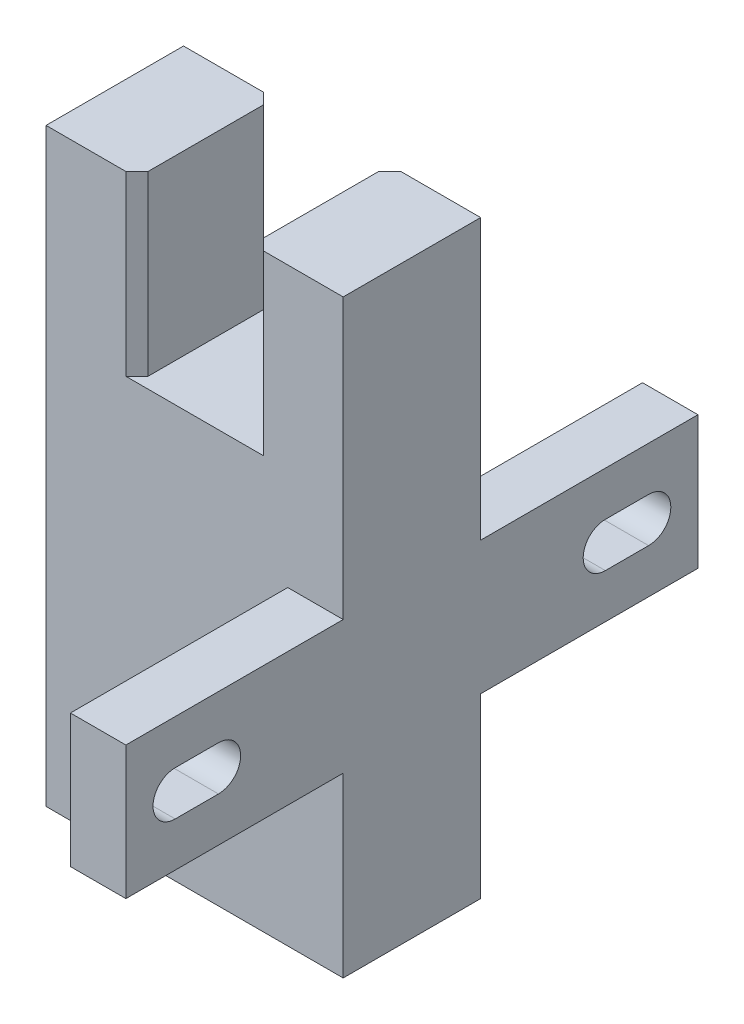
ISO-10303-21;
HEADER;
FILE_DESCRIPTION(('STEP AP214'),'2;1');
FILE_NAME('part.step','',(''),(''),'','','');
FILE_SCHEMA(('AUTOMOTIVE_DESIGN { 1 0 10303 214 1 1 1 1 }'));
ENDSEC;
DATA;
#1=APPLICATION_CONTEXT('core data for automotive mechanical design processes');
#2=APPLICATION_PROTOCOL_DEFINITION('international standard','automotive_design',2000,#1);
#3=PRODUCT_CONTEXT('',#1,'mechanical');
#4=PRODUCT('Part','Part','',(#3));
#5=PRODUCT_RELATED_PRODUCT_CATEGORY('part','',(#4));
#6=PRODUCT_DEFINITION_FORMATION('','',#4);
#7=PRODUCT_DEFINITION_CONTEXT('part definition',#1,'design');
#8=PRODUCT_DEFINITION('design','',#6,#7);
#9=PRODUCT_DEFINITION_SHAPE('','',#8);
#10=(LENGTH_UNIT() NAMED_UNIT(*) SI_UNIT(.MILLI.,.METRE.));
#11=(NAMED_UNIT(*) PLANE_ANGLE_UNIT() SI_UNIT($,.RADIAN.));
#12=(NAMED_UNIT(*) SI_UNIT($,.STERADIAN.) SOLID_ANGLE_UNIT());
#13=UNCERTAINTY_MEASURE_WITH_UNIT(LENGTH_MEASURE(1.E-05),#10,'distance_accuracy_value','');
#14=(GEOMETRIC_REPRESENTATION_CONTEXT(3) GLOBAL_UNCERTAINTY_ASSIGNED_CONTEXT((#13)) GLOBAL_UNIT_ASSIGNED_CONTEXT((#10,
#11,#12)) REPRESENTATION_CONTEXT('',''));
#15=CARTESIAN_POINT('',(0.,0.,0.));
#16=DIRECTION('',(0.,0.,1.));
#17=DIRECTION('',(1.,0.,0.));
#18=AXIS2_PLACEMENT_3D('',#15,#16,#17);
#19=CARTESIAN_POINT('',(0.,0.,6.2));
#20=DIRECTION('',(0.,0.,-1.));
#21=DIRECTION('',(-1.,0.,0.));
#22=AXIS2_PLACEMENT_3D('',#19,#20,#21);
#23=PLANE('',#22);
#24=DIRECTION('',(-1.,0.,0.));
#25=VECTOR('',#24,1.);
#26=CARTESIAN_POINT('',(2.6,8.79547249401344,6.2));
#27=LINE('',#26,#25);
#28=CARTESIAN_POINT('',(6.7,8.79547249401344,6.2));
#29=VERTEX_POINT('',#28);
#30=CARTESIAN_POINT('',(3.1,8.79547249401344,6.2));
#31=VERTEX_POINT('',#30);
#32=EDGE_CURVE('E387',#29,#31,#27,.T.);
#33=ORIENTED_EDGE('',*,*,#32,.T.);
#34=DIRECTION('',(0.,-1.,0.));
#35=VECTOR('',#34,1.);
#36=CARTESIAN_POINT('',(3.1,0.,6.2));
#37=LINE('',#36,#35);
#38=CARTESIAN_POINT('',(3.1,0.795472494013436,6.2));
#39=VERTEX_POINT('',#38);
#40=EDGE_CURVE('E511',#31,#39,#37,.T.);
#41=ORIENTED_EDGE('',*,*,#40,.T.);
#42=DIRECTION('',(-1.,0.,0.));
#43=VECTOR('',#42,1.);
#44=CARTESIAN_POINT('',(2.6,0.795472494013436,6.2));
#45=LINE('',#44,#43);
#46=CARTESIAN_POINT('',(-3.1,0.795472494013436,6.2));
#47=VERTEX_POINT('',#46);
#48=EDGE_CURVE('E391',#39,#47,#45,.T.);
#49=ORIENTED_EDGE('',*,*,#48,.T.);
#50=DIRECTION('',(0.,1.,0.));
#51=VECTOR('',#50,1.);
#52=CARTESIAN_POINT('',(-3.1,0.,6.2));
#53=LINE('',#52,#51);
#54=CARTESIAN_POINT('',(-3.1,8.79547249401344,6.2));
#55=VERTEX_POINT('',#54);
#56=EDGE_CURVE('E507',#47,#55,#53,.T.);
#57=ORIENTED_EDGE('',*,*,#56,.T.);
#58=DIRECTION('',(-1.,0.,0.));
#59=VECTOR('',#58,1.);
#60=CARTESIAN_POINT('',(-2.6,8.79547249401344,6.2));
#61=LINE('',#60,#59);
#62=CARTESIAN_POINT('',(-6.7,8.79547249401344,6.2));
#63=VERTEX_POINT('',#62);
#64=EDGE_CURVE('E395',#55,#63,#61,.T.);
#65=ORIENTED_EDGE('',*,*,#64,.T.);
#66=DIRECTION('',(0.,-1.,0.));
#67=VECTOR('',#66,1.);
#68=CARTESIAN_POINT('',(-6.7,8.79547249401344,6.2));
#69=LINE('',#68,#67);
#70=CARTESIAN_POINT('',(-6.7,-17.8045275059866,6.2));
#71=VERTEX_POINT('',#70);
#72=EDGE_CURVE('E398',#63,#71,#69,.T.);
#73=ORIENTED_EDGE('',*,*,#72,.T.);
#74=DIRECTION('',(1.,0.,0.));
#75=VECTOR('',#74,1.);
#76=CARTESIAN_POINT('',(-6.7,-17.8045275059866,6.2));
#77=LINE('',#76,#75);
#78=CARTESIAN_POINT('',(6.7,-17.8045275059866,6.2));
#79=VERTEX_POINT('',#78);
#80=EDGE_CURVE('E401',#71,#79,#77,.T.);
#81=ORIENTED_EDGE('',*,*,#80,.T.);
#82=DIRECTION('',(0.,1.,0.));
#83=VECTOR('',#82,1.);
#84=CARTESIAN_POINT('',(6.7,8.79547249401344,6.2));
#85=LINE('',#84,#83);
#86=CARTESIAN_POINT('',(6.7,-9.80452750598655,6.2));
#87=VERTEX_POINT('',#86);
#88=EDGE_CURVE('E405',#79,#87,#85,.T.);
#89=ORIENTED_EDGE('',*,*,#88,.T.);
#90=DIRECTION('',(1.,0.,0.));
#91=VECTOR('',#90,1.);
#92=CARTESIAN_POINT('',(6.7,-9.80452750598656,6.2));
#93=LINE('',#92,#91);
#94=CARTESIAN_POINT('',(4.2,-9.80452750598656,6.2));
#95=VERTEX_POINT('',#94);
#96=EDGE_CURVE('E351',#95,#87,#93,.T.);
#97=ORIENTED_EDGE('',*,*,#96,.F.);
#98=DIRECTION('',(0.,-1.,0.));
#99=VECTOR('',#98,1.);
#100=CARTESIAN_POINT('',(4.2,-9.80452750598656,6.2));
#101=LINE('',#100,#99);
#102=CARTESIAN_POINT('',(4.2,-3.80452750598656,6.2));
#103=VERTEX_POINT('',#102);
#104=EDGE_CURVE('E364',#103,#95,#101,.T.);
#105=ORIENTED_EDGE('',*,*,#104,.F.);
#106=DIRECTION('',(-1.,0.,0.));
#107=VECTOR('',#106,1.);
#108=CARTESIAN_POINT('',(6.7,-3.80452750598656,6.2));
#109=LINE('',#108,#107);
#110=CARTESIAN_POINT('',(6.7,-3.80452750598656,6.2));
#111=VERTEX_POINT('',#110);
#112=EDGE_CURVE('E345',#111,#103,#109,.T.);
#113=ORIENTED_EDGE('',*,*,#112,.F.);
#114=EDGE_CURVE('E404',#111,#29,#85,.T.);
#115=ORIENTED_EDGE('',*,*,#114,.T.);
#116=EDGE_LOOP('',(#33,#41,#49,#57,#65,#73,#81,#89,#97,#105,#113,#115));
#117=FACE_BOUND('',#116,.T.);
#118=ADVANCED_FACE('F47',(#117),#23,.F.);
#119=CARTESIAN_POINT('',(2.6,8.79547249401344,6.2));
#120=DIRECTION('',(0.,-1.,0.));
#121=DIRECTION('',(1.,0.,0.));
#122=AXIS2_PLACEMENT_3D('',#119,#120,#121);
#123=PLANE('',#122);
#124=DIRECTION('',(-1.,0.,0.));
#125=VECTOR('',#124,1.);
#126=CARTESIAN_POINT('',(2.6,8.79547249401344,0.));
#127=LINE('',#126,#125);
#128=CARTESIAN_POINT('',(6.7,8.79547249401344,0.));
#129=VERTEX_POINT('',#128);
#130=CARTESIAN_POINT('',(3.1,8.79547249401344,0.));
#131=VERTEX_POINT('',#130);
#132=EDGE_CURVE('E386',#129,#131,#127,.T.);
#133=ORIENTED_EDGE('',*,*,#132,.T.);
#134=DIRECTION('',(-0.707106781186547,0.,0.707106781186548));
#135=VECTOR('',#134,1.);
#136=CARTESIAN_POINT('',(2.6,8.79547249401344,0.500000000000005));
#137=LINE('',#136,#135);
#138=CARTESIAN_POINT('',(2.6,8.79547249401344,0.500000000000006));
#139=VERTEX_POINT('',#138);
#140=EDGE_CURVE('E504',#131,#139,#137,.T.);
#141=ORIENTED_EDGE('',*,*,#140,.T.);
#142=DIRECTION('',(0.,0.,-1.));
#143=VECTOR('',#142,1.);
#144=CARTESIAN_POINT('',(2.6,8.79547249401344,6.2));
#145=LINE('',#144,#143);
#146=CARTESIAN_POINT('',(2.6,8.79547249401344,5.7));
#147=VERTEX_POINT('',#146);
#148=EDGE_CURVE('E454',#147,#139,#145,.T.);
#149=ORIENTED_EDGE('',*,*,#148,.F.);
#150=DIRECTION('',(-0.707106781186545,0.,-0.70710678118655));
#151=VECTOR('',#150,1.);
#152=CARTESIAN_POINT('',(3.1,8.79547249401344,6.2));
#153=LINE('',#152,#151);
#154=EDGE_CURVE('E501',#147,#31,#153,.F.);
#155=ORIENTED_EDGE('',*,*,#154,.T.);
#156=ORIENTED_EDGE('',*,*,#32,.F.);
#157=DIRECTION('',(0.,0.,-1.));
#158=VECTOR('',#157,1.);
#159=CARTESIAN_POINT('',(6.7,8.79547249401344,6.2));
#160=LINE('',#159,#158);
#161=EDGE_CURVE('E408',#29,#129,#160,.T.);
#162=ORIENTED_EDGE('',*,*,#161,.T.);
#163=EDGE_LOOP('',(#133,#141,#149,#155,#156,#162));
#164=FACE_BOUND('',#163,.T.);
#165=ADVANCED_FACE('F545',(#164),#123,.F.);
#166=CARTESIAN_POINT('',(2.6,0.795472494013436,6.2));
#167=DIRECTION('',(1.,0.,0.));
#168=DIRECTION('',(0.,1.,0.));
#169=AXIS2_PLACEMENT_3D('',#166,#167,#168);
#170=PLANE('',#169);
#171=ORIENTED_EDGE('',*,*,#148,.T.);
#172=DIRECTION('',(0.,-1.,0.));
#173=VECTOR('',#172,1.);
#174=CARTESIAN_POINT('',(2.6,0.795472494013436,0.500000000000004));
#175=LINE('',#174,#173);
#176=CARTESIAN_POINT('',(2.6,0.795472494013436,0.500000000000006));
#177=VERTEX_POINT('',#176);
#178=EDGE_CURVE('E490',#139,#177,#175,.T.);
#179=ORIENTED_EDGE('',*,*,#178,.T.);
#180=DIRECTION('',(0.,0.,-1.));
#181=VECTOR('',#180,1.);
#182=CARTESIAN_POINT('',(2.6,0.795472494013436,6.2));
#183=LINE('',#182,#181);
#184=CARTESIAN_POINT('',(2.6,0.795472494013436,5.7));
#185=VERTEX_POINT('',#184);
#186=EDGE_CURVE('E450',#185,#177,#183,.T.);
#187=ORIENTED_EDGE('',*,*,#186,.F.);
#188=DIRECTION('',(0.,1.,0.));
#189=VECTOR('',#188,1.);
#190=CARTESIAN_POINT('',(2.6,0.795472494013436,5.7));
#191=LINE('',#190,#189);
#192=EDGE_CURVE('E487',#185,#147,#191,.T.);
#193=ORIENTED_EDGE('',*,*,#192,.T.);
#194=EDGE_LOOP('',(#171,#179,#187,#193));
#195=FACE_BOUND('',#194,.T.);
#196=ADVANCED_FACE('F555',(#195),#170,.F.);
#197=CARTESIAN_POINT('',(2.6,0.795472494013436,6.2));
#198=DIRECTION('',(0.,-1.,0.));
#199=DIRECTION('',(0.,0.,-1.));
#200=AXIS2_PLACEMENT_3D('',#197,#198,#199);
#201=PLANE('',#200);
#202=DIRECTION('',(-1.,0.,0.));
#203=VECTOR('',#202,1.);
#204=CARTESIAN_POINT('',(2.6,0.795472494013436,0.));
#205=LINE('',#204,#203);
#206=CARTESIAN_POINT('',(3.1,0.795472494013436,0.));
#207=VERTEX_POINT('',#206);
#208=CARTESIAN_POINT('',(-3.1,0.795472494013436,0.));
#209=VERTEX_POINT('',#208);
#210=EDGE_CURVE('E412',#207,#209,#205,.T.);
#211=ORIENTED_EDGE('',*,*,#210,.T.);
#212=DIRECTION('',(0.707106781186547,0.,0.707106781186548));
#213=VECTOR('',#212,1.);
#214=CARTESIAN_POINT('',(2.85,0.795472494013436,5.95));
#215=LINE('',#214,#213);
#216=CARTESIAN_POINT('',(-2.6,0.795472494013436,0.500000000000006));
#217=VERTEX_POINT('',#216);
#218=EDGE_CURVE('E57',#209,#217,#215,.T.);
#219=ORIENTED_EDGE('',*,*,#218,.T.);
#220=DIRECTION('',(0.,0.,-1.));
#221=VECTOR('',#220,1.);
#222=CARTESIAN_POINT('',(-2.6,0.795472494013436,6.2));
#223=LINE('',#222,#221);
#224=CARTESIAN_POINT('',(-2.6,0.795472494013436,5.7));
#225=VERTEX_POINT('',#224);
#226=EDGE_CURVE('E447',#225,#217,#223,.T.);
#227=ORIENTED_EDGE('',*,*,#226,.F.);
#228=DIRECTION('',(0.707106781186545,0.,-0.70710678118655));
#229=VECTOR('',#228,1.);
#230=CARTESIAN_POINT('',(-0.250000000000023,0.795472494013436,3.35));
#231=LINE('',#230,#229);
#232=EDGE_CURVE('E11',#225,#47,#231,.F.);
#233=ORIENTED_EDGE('',*,*,#232,.T.);
#234=ORIENTED_EDGE('',*,*,#48,.F.);
#235=DIRECTION('',(0.707106781186545,0.,0.70710678118655));
#236=VECTOR('',#235,1.);
#237=CARTESIAN_POINT('',(2.85,0.795472494013436,5.95));
#238=LINE('',#237,#236);
#239=EDGE_CURVE('E531',#39,#185,#238,.F.);
#240=ORIENTED_EDGE('',*,*,#239,.T.);
#241=ORIENTED_EDGE('',*,*,#186,.T.);
#242=DIRECTION('',(0.707106781186547,0.,-0.707106781186548));
#243=VECTOR('',#242,1.);
#244=CARTESIAN_POINT('',(-0.249999999999998,0.795472494013436,3.35000000000001));
#245=LINE('',#244,#243);
#246=EDGE_CURVE('E527',#177,#207,#245,.T.);
#247=ORIENTED_EDGE('',*,*,#246,.T.);
#248=EDGE_LOOP('',(#211,#219,#227,#233,#234,#240,#241,#247));
#249=FACE_BOUND('',#248,.T.);
#250=ADVANCED_FACE('F616',(#249),#201,.F.);
#251=CARTESIAN_POINT('',(-2.6,0.795472494013436,6.2));
#252=DIRECTION('',(-1.,0.,0.));
#253=DIRECTION('',(0.,-1.,0.));
#254=AXIS2_PLACEMENT_3D('',#251,#252,#253);
#255=PLANE('',#254);
#256=ORIENTED_EDGE('',*,*,#226,.T.);
#257=DIRECTION('',(0.,1.,0.));
#258=VECTOR('',#257,1.);
#259=CARTESIAN_POINT('',(-2.6,8.79547249401344,0.500000000000004));
#260=LINE('',#259,#258);
#261=CARTESIAN_POINT('',(-2.6,8.79547249401344,0.500000000000006));
#262=VERTEX_POINT('',#261);
#263=EDGE_CURVE('E517',#217,#262,#260,.T.);
#264=ORIENTED_EDGE('',*,*,#263,.T.);
#265=DIRECTION('',(0.,0.,-1.));
#266=VECTOR('',#265,1.);
#267=CARTESIAN_POINT('',(-2.6,8.79547249401344,6.2));
#268=LINE('',#267,#266);
#269=CARTESIAN_POINT('',(-2.6,8.79547249401344,5.7));
#270=VERTEX_POINT('',#269);
#271=EDGE_CURVE('E443',#270,#262,#268,.T.);
#272=ORIENTED_EDGE('',*,*,#271,.F.);
#273=DIRECTION('',(0.,-1.,0.));
#274=VECTOR('',#273,1.);
#275=CARTESIAN_POINT('',(-2.6,0.795472494013436,5.7));
#276=LINE('',#275,#274);
#277=EDGE_CURVE('E70',#270,#225,#276,.T.);
#278=ORIENTED_EDGE('',*,*,#277,.T.);
#279=EDGE_LOOP('',(#256,#264,#272,#278));
#280=FACE_BOUND('',#279,.T.);
#281=ADVANCED_FACE('F612',(#280),#255,.F.);
#282=CARTESIAN_POINT('',(-2.6,8.79547249401344,6.2));
#283=DIRECTION('',(0.,-1.,0.));
#284=DIRECTION('',(0.,0.,-1.));
#285=AXIS2_PLACEMENT_3D('',#282,#283,#284);
#286=PLANE('',#285);
#287=ORIENTED_EDGE('',*,*,#271,.T.);
#288=DIRECTION('',(-0.707106781186547,0.,-0.707106781186548));
#289=VECTOR('',#288,1.);
#290=CARTESIAN_POINT('',(-2.6,8.79547249401344,0.500000000000004));
#291=LINE('',#290,#289);
#292=CARTESIAN_POINT('',(-3.1,8.79547249401344,0.));
#293=VERTEX_POINT('',#292);
#294=EDGE_CURVE('E524',#262,#293,#291,.T.);
#295=ORIENTED_EDGE('',*,*,#294,.T.);
#296=DIRECTION('',(-1.,0.,0.));
#297=VECTOR('',#296,1.);
#298=CARTESIAN_POINT('',(-2.6,8.79547249401344,0.));
#299=LINE('',#298,#297);
#300=CARTESIAN_POINT('',(-6.7,8.79547249401344,0.));
#301=VERTEX_POINT('',#300);
#302=EDGE_CURVE('E415',#293,#301,#299,.T.);
#303=ORIENTED_EDGE('',*,*,#302,.T.);
#304=DIRECTION('',(0.,0.,-1.));
#305=VECTOR('',#304,1.);
#306=CARTESIAN_POINT('',(-6.7,8.79547249401344,6.2));
#307=LINE('',#306,#305);
#308=EDGE_CURVE('E439',#63,#301,#307,.T.);
#309=ORIENTED_EDGE('',*,*,#308,.F.);
#310=ORIENTED_EDGE('',*,*,#64,.F.);
#311=DIRECTION('',(-0.707106781186545,0.,0.70710678118655));
#312=VECTOR('',#311,1.);
#313=CARTESIAN_POINT('',(-3.1,8.79547249401343,6.2));
#314=LINE('',#313,#312);
#315=EDGE_CURVE('E521',#55,#270,#314,.F.);
#316=ORIENTED_EDGE('',*,*,#315,.T.);
#317=EDGE_LOOP('',(#287,#295,#303,#309,#310,#316));
#318=FACE_BOUND('',#317,.T.);
#319=ADVANCED_FACE('F608',(#318),#286,.F.);
#320=CARTESIAN_POINT('',(-6.7,8.79547249401344,6.2));
#321=DIRECTION('',(1.,0.,0.));
#322=DIRECTION('',(0.,0.,-1.));
#323=AXIS2_PLACEMENT_3D('',#320,#321,#322);
#324=PLANE('',#323);
#325=DIRECTION('',(0.,-1.,0.));
#326=VECTOR('',#325,1.);
#327=CARTESIAN_POINT('',(-6.7,8.79547249401344,0.));
#328=LINE('',#327,#326);
#329=CARTESIAN_POINT('',(-6.7,-17.8045275059866,0.));
#330=VERTEX_POINT('',#329);
#331=EDGE_CURVE('E418',#301,#330,#328,.T.);
#332=ORIENTED_EDGE('',*,*,#331,.T.);
#333=DIRECTION('',(0.,0.,-1.));
#334=VECTOR('',#333,1.);
#335=CARTESIAN_POINT('',(-6.7,-17.8045275059866,6.2));
#336=LINE('',#335,#334);
#337=EDGE_CURVE('E435',#71,#330,#336,.T.);
#338=ORIENTED_EDGE('',*,*,#337,.F.);
#339=ORIENTED_EDGE('',*,*,#72,.F.);
#340=ORIENTED_EDGE('',*,*,#308,.T.);
#341=EDGE_LOOP('',(#332,#338,#339,#340));
#342=FACE_BOUND('',#341,.T.);
#343=ADVANCED_FACE('F604',(#342),#324,.F.);
#344=CARTESIAN_POINT('',(-6.7,-17.8045275059866,6.2));
#345=DIRECTION('',(0.,1.,0.));
#346=DIRECTION('',(0.,0.,1.));
#347=AXIS2_PLACEMENT_3D('',#344,#345,#346);
#348=PLANE('',#347);
#349=DIRECTION('',(1.,0.,0.));
#350=VECTOR('',#349,1.);
#351=CARTESIAN_POINT('',(-6.7,-17.8045275059866,0.));
#352=LINE('',#351,#350);
#353=CARTESIAN_POINT('',(6.7,-17.8045275059866,0.));
#354=VERTEX_POINT('',#353);
#355=EDGE_CURVE('E421',#330,#354,#352,.T.);
#356=ORIENTED_EDGE('',*,*,#355,.T.);
#357=DIRECTION('',(0.,0.,-1.));
#358=VECTOR('',#357,1.);
#359=CARTESIAN_POINT('',(6.7,-17.8045275059866,6.2));
#360=LINE('',#359,#358);
#361=EDGE_CURVE('E431',#79,#354,#360,.T.);
#362=ORIENTED_EDGE('',*,*,#361,.F.);
#363=ORIENTED_EDGE('',*,*,#80,.F.);
#364=ORIENTED_EDGE('',*,*,#337,.T.);
#365=EDGE_LOOP('',(#356,#362,#363,#364));
#366=FACE_BOUND('',#365,.T.);
#367=ADVANCED_FACE('F601',(#366),#348,.F.);
#368=CARTESIAN_POINT('',(6.7,8.79547249401344,6.2));
#369=DIRECTION('',(-1.,0.,0.));
#370=DIRECTION('',(0.,-1.,0.));
#371=AXIS2_PLACEMENT_3D('',#368,#369,#370);
#372=PLANE('',#371);
#373=DIRECTION('',(0.,0.,-1.));
#374=VECTOR('',#373,1.);
#375=CARTESIAN_POINT('',(6.7,-7.80452750598656,13.7757131765971));
#376=LINE('',#375,#374);
#377=CARTESIAN_POINT('',(6.7,-7.80452750598657,13.7757131765971));
#378=VERTEX_POINT('',#377);
#379=CARTESIAN_POINT('',(6.7,-7.80452750598656,11.8242868234029));
#380=VERTEX_POINT('',#379);
#381=EDGE_CURVE('E251',#378,#380,#376,.T.);
#382=ORIENTED_EDGE('',*,*,#381,.F.);
#383=CARTESIAN_POINT('',(6.7,-6.80452750598656,13.7757131765971));
#384=DIRECTION('',(1.,0.,0.));
#385=DIRECTION('',(0.,1.,0.));
#386=AXIS2_PLACEMENT_3D('',#383,#384,#385);
#387=CIRCLE('',#386,1.);
#388=CARTESIAN_POINT('',(6.7,-5.80452750598656,13.7757131765971));
#389=VERTEX_POINT('',#388);
#390=EDGE_CURVE('E257',#389,#378,#387,.T.);
#391=ORIENTED_EDGE('',*,*,#390,.F.);
#392=DIRECTION('',(0.,0.,1.));
#393=VECTOR('',#392,1.);
#394=CARTESIAN_POINT('',(6.7,-5.80452750598656,13.7757131765971));
#395=LINE('',#394,#393);
#396=CARTESIAN_POINT('',(6.7,-5.80452750598656,11.8242868234029));
#397=VERTEX_POINT('',#396);
#398=EDGE_CURVE('E262',#397,#389,#395,.T.);
#399=ORIENTED_EDGE('',*,*,#398,.F.);
#400=CARTESIAN_POINT('',(6.7,-6.80452750598656,11.8242868234029));
#401=DIRECTION('',(1.,0.,0.));
#402=DIRECTION('',(0.,1.,0.));
#403=AXIS2_PLACEMENT_3D('',#400,#401,#402);
#404=CIRCLE('',#403,1.);
#405=EDGE_CURVE('E239',#380,#397,#404,.T.);
#406=ORIENTED_EDGE('',*,*,#405,.F.);
#407=EDGE_LOOP('',(#382,#391,#399,#406));
#408=FACE_BOUND('',#407,.T.);
#409=DIRECTION('',(0.,0.,1.));
#410=VECTOR('',#409,1.);
#411=CARTESIAN_POINT('',(6.7,-5.80452750598656,-7.57571317659705));
#412=LINE('',#411,#410);
#413=CARTESIAN_POINT('',(6.7,-5.80452750598656,-7.57571317659705));
#414=VERTEX_POINT('',#413);
#415=CARTESIAN_POINT('',(6.7,-5.80452750598656,-5.62428682340294));
#416=VERTEX_POINT('',#415);
#417=EDGE_CURVE('E298',#414,#416,#412,.T.);
#418=ORIENTED_EDGE('',*,*,#417,.F.);
#419=CARTESIAN_POINT('',(6.7,-6.80452750598655,-7.57571317659706));
#420=DIRECTION('',(1.,0.,0.));
#421=DIRECTION('',(0.,-1.,0.));
#422=AXIS2_PLACEMENT_3D('',#419,#420,#421);
#423=CIRCLE('',#422,1.);
#424=CARTESIAN_POINT('',(6.7,-7.80452750598656,-7.57571317659705));
#425=VERTEX_POINT('',#424);
#426=EDGE_CURVE('E302',#425,#414,#423,.T.);
#427=ORIENTED_EDGE('',*,*,#426,.F.);
#428=DIRECTION('',(0.,0.,-1.));
#429=VECTOR('',#428,1.);
#430=CARTESIAN_POINT('',(6.7,-7.80452750598656,-7.57571317659705));
#431=LINE('',#430,#429);
#432=CARTESIAN_POINT('',(6.7,-7.80452750598656,-5.62428682340294));
#433=VERTEX_POINT('',#432);
#434=EDGE_CURVE('E281',#433,#425,#431,.T.);
#435=ORIENTED_EDGE('',*,*,#434,.F.);
#436=CARTESIAN_POINT('',(6.7,-6.80452750598656,-5.62428682340294));
#437=DIRECTION('',(1.,0.,0.));
#438=DIRECTION('',(0.,-1.,0.));
#439=AXIS2_PLACEMENT_3D('',#436,#437,#438);
#440=CIRCLE('',#439,1.);
#441=EDGE_CURVE('E294',#416,#433,#440,.T.);
#442=ORIENTED_EDGE('',*,*,#441,.F.);
#443=EDGE_LOOP('',(#418,#427,#435,#442));
#444=FACE_BOUND('',#443,.T.);
#445=DIRECTION('',(0.,1.,0.));
#446=VECTOR('',#445,1.);
#447=CARTESIAN_POINT('',(6.7,8.79547249401344,0.));
#448=LINE('',#447,#446);
#449=CARTESIAN_POINT('',(6.7,-9.80452750598655,0.));
#450=VERTEX_POINT('',#449);
#451=EDGE_CURVE('E392',#354,#450,#448,.T.);
#452=ORIENTED_EDGE('',*,*,#451,.T.);
#453=DIRECTION('',(0.,0.,1.));
#454=VECTOR('',#453,1.);
#455=CARTESIAN_POINT('',(6.7,-9.80452750598656,-9.8));
#456=LINE('',#455,#454);
#457=CARTESIAN_POINT('',(6.7,-9.80452750598656,-9.8));
#458=VERTEX_POINT('',#457);
#459=EDGE_CURVE('E341',#458,#450,#456,.T.);
#460=ORIENTED_EDGE('',*,*,#459,.F.);
#461=DIRECTION('',(0.,-1.,0.));
#462=VECTOR('',#461,1.);
#463=CARTESIAN_POINT('',(6.7,-3.80452750598656,-9.8));
#464=LINE('',#463,#462);
#465=CARTESIAN_POINT('',(6.7,-3.80452750598656,-9.8));
#466=VERTEX_POINT('',#465);
#467=EDGE_CURVE('E305',#466,#458,#464,.T.);
#468=ORIENTED_EDGE('',*,*,#467,.F.);
#469=DIRECTION('',(0.,0.,1.));
#470=VECTOR('',#469,1.);
#471=CARTESIAN_POINT('',(6.7,-3.80452750598656,-9.8));
#472=LINE('',#471,#470);
#473=CARTESIAN_POINT('',(6.7,-3.80452750598656,0.));
#474=VERTEX_POINT('',#473);
#475=EDGE_CURVE('E319',#466,#474,#472,.T.);
#476=ORIENTED_EDGE('',*,*,#475,.T.);
#477=EDGE_CURVE('E424',#474,#129,#448,.T.);
#478=ORIENTED_EDGE('',*,*,#477,.T.);
#479=ORIENTED_EDGE('',*,*,#161,.F.);
#480=ORIENTED_EDGE('',*,*,#114,.F.);
#481=DIRECTION('',(0.,0.,-1.));
#482=VECTOR('',#481,1.);
#483=CARTESIAN_POINT('',(6.7,-3.80452750598656,16.));
#484=LINE('',#483,#482);
#485=CARTESIAN_POINT('',(6.7,-3.80452750598656,16.));
#486=VERTEX_POINT('',#485);
#487=EDGE_CURVE('E382',#486,#111,#484,.T.);
#488=ORIENTED_EDGE('',*,*,#487,.F.);
#489=DIRECTION('',(0.,1.,0.));
#490=VECTOR('',#489,1.);
#491=CARTESIAN_POINT('',(6.7,-9.80452750598656,16.));
#492=LINE('',#491,#490);
#493=CARTESIAN_POINT('',(6.7,-9.80452750598656,16.));
#494=VERTEX_POINT('',#493);
#495=EDGE_CURVE('E346',#494,#486,#492,.T.);
#496=ORIENTED_EDGE('',*,*,#495,.F.);
#497=DIRECTION('',(0.,0.,-1.));
#498=VECTOR('',#497,1.);
#499=CARTESIAN_POINT('',(6.7,-9.80452750598656,16.));
#500=LINE('',#499,#498);
#501=EDGE_CURVE('E360',#494,#87,#500,.T.);
#502=ORIENTED_EDGE('',*,*,#501,.T.);
#503=ORIENTED_EDGE('',*,*,#88,.F.);
#504=ORIENTED_EDGE('',*,*,#361,.T.);
#505=EDGE_LOOP('',(#452,#460,#468,#476,#478,#479,#480,#488,#496,#502,#503,#504));
#506=FACE_BOUND('',#505,.T.);
#507=ADVANCED_FACE('F259',(#408,#444,#506),#372,.F.);
#508=CARTESIAN_POINT('',(0.,0.,0.));
#509=DIRECTION('',(0.,0.,-1.));
#510=DIRECTION('',(-1.,0.,0.));
#511=AXIS2_PLACEMENT_3D('',#508,#509,#510);
#512=PLANE('',#511);
#513=ORIENTED_EDGE('',*,*,#210,.F.);
#514=DIRECTION('',(0.,1.,0.));
#515=VECTOR('',#514,1.);
#516=CARTESIAN_POINT('',(3.1,8.79547249401344,0.));
#517=LINE('',#516,#515);
#518=EDGE_CURVE('E498',#207,#131,#517,.T.);
#519=ORIENTED_EDGE('',*,*,#518,.T.);
#520=ORIENTED_EDGE('',*,*,#132,.F.);
#521=ORIENTED_EDGE('',*,*,#477,.F.);
#522=DIRECTION('',(1.,0.,0.));
#523=VECTOR('',#522,1.);
#524=CARTESIAN_POINT('',(6.7,-3.80452750598656,0.));
#525=LINE('',#524,#523);
#526=CARTESIAN_POINT('',(4.2,-3.80452750598656,0.));
#527=VERTEX_POINT('',#526);
#528=EDGE_CURVE('E310',#527,#474,#525,.T.);
#529=ORIENTED_EDGE('',*,*,#528,.F.);
#530=DIRECTION('',(0.,1.,0.));
#531=VECTOR('',#530,1.);
#532=CARTESIAN_POINT('',(4.2,-3.80452750598656,0.));
#533=LINE('',#532,#531);
#534=CARTESIAN_POINT('',(4.2,-9.80452750598656,0.));
#535=VERTEX_POINT('',#534);
#536=EDGE_CURVE('E323',#535,#527,#533,.T.);
#537=ORIENTED_EDGE('',*,*,#536,.F.);
#538=DIRECTION('',(-1.,0.,0.));
#539=VECTOR('',#538,1.);
#540=CARTESIAN_POINT('',(6.7,-9.80452750598656,0.));
#541=LINE('',#540,#539);
#542=EDGE_CURVE('E272',#450,#535,#541,.T.);
#543=ORIENTED_EDGE('',*,*,#542,.F.);
#544=ORIENTED_EDGE('',*,*,#451,.F.);
#545=ORIENTED_EDGE('',*,*,#355,.F.);
#546=ORIENTED_EDGE('',*,*,#331,.F.);
#547=ORIENTED_EDGE('',*,*,#302,.F.);
#548=DIRECTION('',(0.,-1.,0.));
#549=VECTOR('',#548,1.);
#550=CARTESIAN_POINT('',(-3.1,0.795472494013436,0.));
#551=LINE('',#550,#549);
#552=EDGE_CURVE('E494',#293,#209,#551,.T.);
#553=ORIENTED_EDGE('',*,*,#552,.T.);
#554=EDGE_LOOP('',(#513,#519,#520,#521,#529,#537,#543,#544,#545,#546,#547,#553));
#555=FACE_BOUND('',#554,.T.);
#556=ADVANCED_FACE('F547',(#555),#512,.T.);
#557=CARTESIAN_POINT('',(6.7,-3.80452750598656,16.));
#558=DIRECTION('',(0.,-1.,0.));
#559=DIRECTION('',(0.,0.,-1.));
#560=AXIS2_PLACEMENT_3D('',#557,#558,#559);
#561=PLANE('',#560);
#562=ORIENTED_EDGE('',*,*,#112,.T.);
#563=DIRECTION('',(0.,0.,-1.));
#564=VECTOR('',#563,1.);
#565=CARTESIAN_POINT('',(4.2,-3.80452750598656,16.));
#566=LINE('',#565,#564);
#567=CARTESIAN_POINT('',(4.2,-3.80452750598656,16.));
#568=VERTEX_POINT('',#567);
#569=EDGE_CURVE('E378',#568,#103,#566,.T.);
#570=ORIENTED_EDGE('',*,*,#569,.F.);
#571=DIRECTION('',(-1.,0.,0.));
#572=VECTOR('',#571,1.);
#573=CARTESIAN_POINT('',(6.7,-3.80452750598656,16.));
#574=LINE('',#573,#572);
#575=EDGE_CURVE('E350',#486,#568,#574,.T.);
#576=ORIENTED_EDGE('',*,*,#575,.F.);
#577=ORIENTED_EDGE('',*,*,#487,.T.);
#578=EDGE_LOOP('',(#562,#570,#576,#577));
#579=FACE_BOUND('',#578,.T.);
#580=ADVANCED_FACE('F566',(#579),#561,.F.);
#581=CARTESIAN_POINT('',(4.2,-9.80452750598656,16.));
#582=DIRECTION('',(1.,0.,0.));
#583=DIRECTION('',(0.,0.,-1.));
#584=AXIS2_PLACEMENT_3D('',#581,#582,#583);
#585=PLANE('',#584);
#586=DIRECTION('',(0.,0.,1.));
#587=VECTOR('',#586,1.);
#588=CARTESIAN_POINT('',(4.2,-5.80452750598656,16.));
#589=LINE('',#588,#587);
#590=CARTESIAN_POINT('',(4.2,-5.80452750598656,11.8242868234029));
#591=VERTEX_POINT('',#590);
#592=CARTESIAN_POINT('',(4.2,-5.80452750598656,13.7757131765971));
#593=VERTEX_POINT('',#592);
#594=EDGE_CURVE('E479',#591,#593,#589,.T.);
#595=ORIENTED_EDGE('',*,*,#594,.T.);
#596=CARTESIAN_POINT('',(4.2,-6.80452750598656,13.7757131765971));
#597=DIRECTION('',(1.,0.,0.));
#598=DIRECTION('',(0.,0.,-1.));
#599=AXIS2_PLACEMENT_3D('',#596,#597,#598);
#600=CIRCLE('',#599,1.);
#601=CARTESIAN_POINT('',(4.2,-7.80452750598656,13.7757131765971));
#602=VERTEX_POINT('',#601);
#603=EDGE_CURVE('E483',#593,#602,#600,.T.);
#604=ORIENTED_EDGE('',*,*,#603,.T.);
#605=DIRECTION('',(0.,0.,-1.));
#606=VECTOR('',#605,1.);
#607=CARTESIAN_POINT('',(4.2,-7.80452750598656,16.));
#608=LINE('',#607,#606);
#609=CARTESIAN_POINT('',(4.2,-7.80452750598656,11.8242868234029));
#610=VERTEX_POINT('',#609);
#611=EDGE_CURVE('E474',#602,#610,#608,.T.);
#612=ORIENTED_EDGE('',*,*,#611,.T.);
#613=CARTESIAN_POINT('',(4.2,-6.80452750598656,11.8242868234029));
#614=DIRECTION('',(1.,0.,0.));
#615=DIRECTION('',(0.,0.,-1.));
#616=AXIS2_PLACEMENT_3D('',#613,#614,#615);
#617=CIRCLE('',#616,1.);
#618=EDGE_CURVE('E242',#610,#591,#617,.T.);
#619=ORIENTED_EDGE('',*,*,#618,.T.);
#620=EDGE_LOOP('',(#595,#604,#612,#619));
#621=FACE_BOUND('',#620,.T.);
#622=ORIENTED_EDGE('',*,*,#104,.T.);
#623=DIRECTION('',(0.,0.,-1.));
#624=VECTOR('',#623,1.);
#625=CARTESIAN_POINT('',(4.2,-9.80452750598656,16.));
#626=LINE('',#625,#624);
#627=CARTESIAN_POINT('',(4.2,-9.80452750598656,16.));
#628=VERTEX_POINT('',#627);
#629=EDGE_CURVE('E374',#628,#95,#626,.T.);
#630=ORIENTED_EDGE('',*,*,#629,.F.);
#631=DIRECTION('',(0.,-1.,0.));
#632=VECTOR('',#631,1.);
#633=CARTESIAN_POINT('',(4.2,-9.80452750598656,16.));
#634=LINE('',#633,#632);
#635=EDGE_CURVE('E354',#568,#628,#634,.T.);
#636=ORIENTED_EDGE('',*,*,#635,.F.);
#637=ORIENTED_EDGE('',*,*,#569,.T.);
#638=EDGE_LOOP('',(#622,#630,#636,#637));
#639=FACE_BOUND('',#638,.T.);
#640=ADVANCED_FACE('F578',(#621,#639),#585,.F.);
#641=CARTESIAN_POINT('',(6.7,-9.80452750598656,16.));
#642=DIRECTION('',(0.,1.,0.));
#643=DIRECTION('',(0.,0.,1.));
#644=AXIS2_PLACEMENT_3D('',#641,#642,#643);
#645=PLANE('',#644);
#646=ORIENTED_EDGE('',*,*,#96,.T.);
#647=ORIENTED_EDGE('',*,*,#501,.F.);
#648=DIRECTION('',(1.,0.,0.));
#649=VECTOR('',#648,1.);
#650=CARTESIAN_POINT('',(6.7,-9.80452750598656,16.));
#651=LINE('',#650,#649);
#652=EDGE_CURVE('E357',#628,#494,#651,.T.);
#653=ORIENTED_EDGE('',*,*,#652,.F.);
#654=ORIENTED_EDGE('',*,*,#629,.T.);
#655=EDGE_LOOP('',(#646,#647,#653,#654));
#656=FACE_BOUND('',#655,.T.);
#657=ADVANCED_FACE('F575',(#656),#645,.F.);
#658=CARTESIAN_POINT('',(0.,0.,16.));
#659=DIRECTION('',(0.,0.,1.));
#660=DIRECTION('',(1.,0.,0.));
#661=AXIS2_PLACEMENT_3D('',#658,#659,#660);
#662=PLANE('',#661);
#663=ORIENTED_EDGE('',*,*,#495,.T.);
#664=ORIENTED_EDGE('',*,*,#575,.T.);
#665=ORIENTED_EDGE('',*,*,#635,.T.);
#666=ORIENTED_EDGE('',*,*,#652,.T.);
#667=EDGE_LOOP('',(#663,#664,#665,#666));
#668=FACE_BOUND('',#667,.T.);
#669=ADVANCED_FACE('F570',(#668),#662,.T.);
#670=CARTESIAN_POINT('',(6.7,-9.80452750598656,-9.8));
#671=DIRECTION('',(0.,1.,0.));
#672=DIRECTION('',(0.,0.,1.));
#673=AXIS2_PLACEMENT_3D('',#670,#671,#672);
#674=PLANE('',#673);
#675=ORIENTED_EDGE('',*,*,#542,.T.);
#676=DIRECTION('',(0.,0.,1.));
#677=VECTOR('',#676,1.);
#678=CARTESIAN_POINT('',(4.2,-9.80452750598656,-9.8));
#679=LINE('',#678,#677);
#680=CARTESIAN_POINT('',(4.2,-9.80452750598656,-9.8));
#681=VERTEX_POINT('',#680);
#682=EDGE_CURVE('E337',#681,#535,#679,.T.);
#683=ORIENTED_EDGE('',*,*,#682,.F.);
#684=DIRECTION('',(-1.,0.,0.));
#685=VECTOR('',#684,1.);
#686=CARTESIAN_POINT('',(6.7,-9.80452750598656,-9.8));
#687=LINE('',#686,#685);
#688=EDGE_CURVE('E309',#458,#681,#687,.T.);
#689=ORIENTED_EDGE('',*,*,#688,.F.);
#690=ORIENTED_EDGE('',*,*,#459,.T.);
#691=EDGE_LOOP('',(#675,#683,#689,#690));
#692=FACE_BOUND('',#691,.T.);
#693=ADVANCED_FACE('F657',(#692),#674,.F.);
#694=CARTESIAN_POINT('',(4.2,-3.80452750598656,-9.8));
#695=DIRECTION('',(1.,0.,0.));
#696=DIRECTION('',(0.,1.,0.));
#697=AXIS2_PLACEMENT_3D('',#694,#695,#696);
#698=PLANE('',#697);
#699=DIRECTION('',(0.,0.,-1.));
#700=VECTOR('',#699,1.);
#701=CARTESIAN_POINT('',(4.2,-7.80452750598656,-9.8));
#702=LINE('',#701,#700);
#703=CARTESIAN_POINT('',(4.2,-7.80452750598656,-5.62428682340294));
#704=VERTEX_POINT('',#703);
#705=CARTESIAN_POINT('',(4.2,-7.80452750598656,-7.57571317659705));
#706=VERTEX_POINT('',#705);
#707=EDGE_CURVE('E466',#704,#706,#702,.T.);
#708=ORIENTED_EDGE('',*,*,#707,.T.);
#709=CARTESIAN_POINT('',(4.2,-6.80452750598655,-7.57571317659706));
#710=DIRECTION('',(1.,0.,0.));
#711=DIRECTION('',(0.,1.,0.));
#712=AXIS2_PLACEMENT_3D('',#709,#710,#711);
#713=CIRCLE('',#712,1.);
#714=CARTESIAN_POINT('',(4.2,-5.80452750598656,-7.57571317659705));
#715=VERTEX_POINT('',#714);
#716=EDGE_CURVE('E470',#706,#715,#713,.T.);
#717=ORIENTED_EDGE('',*,*,#716,.T.);
#718=DIRECTION('',(0.,0.,1.));
#719=VECTOR('',#718,1.);
#720=CARTESIAN_POINT('',(4.2,-5.80452750598656,-9.8));
#721=LINE('',#720,#719);
#722=CARTESIAN_POINT('',(4.2,-5.80452750598656,-5.62428682340294));
#723=VERTEX_POINT('',#722);
#724=EDGE_CURVE('E458',#715,#723,#721,.T.);
#725=ORIENTED_EDGE('',*,*,#724,.T.);
#726=CARTESIAN_POINT('',(4.2,-6.80452750598656,-5.62428682340294));
#727=DIRECTION('',(1.,0.,0.));
#728=DIRECTION('',(0.,1.,0.));
#729=AXIS2_PLACEMENT_3D('',#726,#727,#728);
#730=CIRCLE('',#729,1.);
#731=EDGE_CURVE('E462',#723,#704,#730,.T.);
#732=ORIENTED_EDGE('',*,*,#731,.T.);
#733=EDGE_LOOP('',(#708,#717,#725,#732));
#734=FACE_BOUND('',#733,.T.);
#735=ORIENTED_EDGE('',*,*,#536,.T.);
#736=DIRECTION('',(0.,0.,1.));
#737=VECTOR('',#736,1.);
#738=CARTESIAN_POINT('',(4.2,-3.80452750598656,-9.8));
#739=LINE('',#738,#737);
#740=CARTESIAN_POINT('',(4.2,-3.80452750598656,-9.8));
#741=VERTEX_POINT('',#740);
#742=EDGE_CURVE('E333',#741,#527,#739,.T.);
#743=ORIENTED_EDGE('',*,*,#742,.F.);
#744=DIRECTION('',(0.,1.,0.));
#745=VECTOR('',#744,1.);
#746=CARTESIAN_POINT('',(4.2,-3.80452750598656,-9.8));
#747=LINE('',#746,#745);
#748=EDGE_CURVE('E313',#681,#741,#747,.T.);
#749=ORIENTED_EDGE('',*,*,#748,.F.);
#750=ORIENTED_EDGE('',*,*,#682,.T.);
#751=EDGE_LOOP('',(#735,#743,#749,#750));
#752=FACE_BOUND('',#751,.T.);
#753=ADVANCED_FACE('F660',(#734,#752),#698,.F.);
#754=CARTESIAN_POINT('',(6.7,-3.80452750598656,-9.8));
#755=DIRECTION('',(0.,-1.,0.));
#756=DIRECTION('',(0.,0.,-1.));
#757=AXIS2_PLACEMENT_3D('',#754,#755,#756);
#758=PLANE('',#757);
#759=ORIENTED_EDGE('',*,*,#528,.T.);
#760=ORIENTED_EDGE('',*,*,#475,.F.);
#761=DIRECTION('',(1.,0.,0.));
#762=VECTOR('',#761,1.);
#763=CARTESIAN_POINT('',(6.7,-3.80452750598656,-9.8));
#764=LINE('',#763,#762);
#765=EDGE_CURVE('E316',#741,#466,#764,.T.);
#766=ORIENTED_EDGE('',*,*,#765,.F.);
#767=ORIENTED_EDGE('',*,*,#742,.T.);
#768=EDGE_LOOP('',(#759,#760,#766,#767));
#769=FACE_BOUND('',#768,.T.);
#770=ADVANCED_FACE('F666',(#769),#758,.F.);
#771=CARTESIAN_POINT('',(0.,0.,-9.8));
#772=DIRECTION('',(0.,0.,-1.));
#773=DIRECTION('',(-1.,0.,0.));
#774=AXIS2_PLACEMENT_3D('',#771,#772,#773);
#775=PLANE('',#774);
#776=ORIENTED_EDGE('',*,*,#467,.T.);
#777=ORIENTED_EDGE('',*,*,#688,.T.);
#778=ORIENTED_EDGE('',*,*,#748,.T.);
#779=ORIENTED_EDGE('',*,*,#765,.T.);
#780=EDGE_LOOP('',(#776,#777,#778,#779));
#781=FACE_BOUND('',#780,.T.);
#782=ADVANCED_FACE('F664',(#781),#775,.T.);
#783=CARTESIAN_POINT('',(-6.7,-6.80452750598656,-7.57571317659706));
#784=DIRECTION('',(1.,0.,0.));
#785=DIRECTION('',(0.,1.,0.));
#786=AXIS2_PLACEMENT_3D('',#783,#784,#785);
#787=CYLINDRICAL_SURFACE('',#786,1.);
#788=DIRECTION('',(1.,0.,0.));
#789=VECTOR('',#788,1.);
#790=CARTESIAN_POINT('',(-6.7,-7.80452750598656,-7.57571317659705));
#791=LINE('',#790,#789);
#792=EDGE_CURVE('E288',#706,#425,#791,.T.);
#793=ORIENTED_EDGE('',*,*,#792,.T.);
#794=ORIENTED_EDGE('',*,*,#426,.T.);
#795=DIRECTION('',(1.,0.,0.));
#796=VECTOR('',#795,1.);
#797=CARTESIAN_POINT('',(-6.7,-5.80452750598656,-7.57571317659705));
#798=LINE('',#797,#796);
#799=EDGE_CURVE('E277',#715,#414,#798,.T.);
#800=ORIENTED_EDGE('',*,*,#799,.F.);
#801=ORIENTED_EDGE('',*,*,#716,.F.);
#802=EDGE_LOOP('',(#793,#794,#800,#801));
#803=FACE_BOUND('',#802,.T.);
#804=ADVANCED_FACE('F673',(#803),#787,.F.);
#805=CARTESIAN_POINT('',(-6.7,-7.80452750598656,-7.57571317659705));
#806=DIRECTION('',(0.,-1.,0.));
#807=DIRECTION('',(1.,0.,0.));
#808=AXIS2_PLACEMENT_3D('',#805,#806,#807);
#809=PLANE('',#808);
#810=DIRECTION('',(1.,0.,0.));
#811=VECTOR('',#810,1.);
#812=CARTESIAN_POINT('',(-6.7,-7.80452750598656,-5.62428682340294));
#813=LINE('',#812,#811);
#814=EDGE_CURVE('E285',#704,#433,#813,.T.);
#815=ORIENTED_EDGE('',*,*,#814,.T.);
#816=ORIENTED_EDGE('',*,*,#434,.T.);
#817=ORIENTED_EDGE('',*,*,#792,.F.);
#818=ORIENTED_EDGE('',*,*,#707,.F.);
#819=EDGE_LOOP('',(#815,#816,#817,#818));
#820=FACE_BOUND('',#819,.T.);
#821=ADVANCED_FACE('F720',(#820),#809,.F.);
#822=CARTESIAN_POINT('',(-6.7,-6.80452750598656,-5.62428682340294));
#823=DIRECTION('',(1.,0.,0.));
#824=DIRECTION('',(0.,1.,0.));
#825=AXIS2_PLACEMENT_3D('',#822,#823,#824);
#826=CYLINDRICAL_SURFACE('',#825,1.);
#827=DIRECTION('',(1.,0.,0.));
#828=VECTOR('',#827,1.);
#829=CARTESIAN_POINT('',(-6.7,-5.80452750598656,-5.62428682340294));
#830=LINE('',#829,#828);
#831=EDGE_CURVE('E282',#723,#416,#830,.T.);
#832=ORIENTED_EDGE('',*,*,#831,.T.);
#833=ORIENTED_EDGE('',*,*,#441,.T.);
#834=ORIENTED_EDGE('',*,*,#814,.F.);
#835=ORIENTED_EDGE('',*,*,#731,.F.);
#836=EDGE_LOOP('',(#832,#833,#834,#835));
#837=FACE_BOUND('',#836,.T.);
#838=ADVANCED_FACE('F730',(#837),#826,.F.);
#839=CARTESIAN_POINT('',(-6.7,-5.80452750598656,-7.57571317659705));
#840=DIRECTION('',(0.,1.,0.));
#841=DIRECTION('',(-1.,0.,0.));
#842=AXIS2_PLACEMENT_3D('',#839,#840,#841);
#843=PLANE('',#842);
#844=ORIENTED_EDGE('',*,*,#799,.T.);
#845=ORIENTED_EDGE('',*,*,#417,.T.);
#846=ORIENTED_EDGE('',*,*,#831,.F.);
#847=ORIENTED_EDGE('',*,*,#724,.F.);
#848=EDGE_LOOP('',(#844,#845,#846,#847));
#849=FACE_BOUND('',#848,.T.);
#850=ADVANCED_FACE('F739',(#849),#843,.F.);
#851=CARTESIAN_POINT('',(-6.7,-6.80452750598656,13.7757131765971));
#852=DIRECTION('',(1.,0.,0.));
#853=DIRECTION('',(0.,1.,0.));
#854=AXIS2_PLACEMENT_3D('',#851,#852,#853);
#855=CYLINDRICAL_SURFACE('',#854,1.);
#856=DIRECTION('',(1.,0.,0.));
#857=VECTOR('',#856,1.);
#858=CARTESIAN_POINT('',(-6.7,-5.80452750598656,13.7757131765971));
#859=LINE('',#858,#857);
#860=EDGE_CURVE('E269',#593,#389,#859,.T.);
#861=ORIENTED_EDGE('',*,*,#860,.T.);
#862=ORIENTED_EDGE('',*,*,#390,.T.);
#863=DIRECTION('',(1.,0.,0.));
#864=VECTOR('',#863,1.);
#865=CARTESIAN_POINT('',(-6.7,-7.80452750598656,13.7757131765971));
#866=LINE('',#865,#864);
#867=EDGE_CURVE('E247',#602,#378,#866,.T.);
#868=ORIENTED_EDGE('',*,*,#867,.F.);
#869=ORIENTED_EDGE('',*,*,#603,.F.);
#870=EDGE_LOOP('',(#861,#862,#868,#869));
#871=FACE_BOUND('',#870,.T.);
#872=ADVANCED_FACE('F749',(#871),#855,.F.);
#873=CARTESIAN_POINT('',(-6.7,-5.80452750598656,13.7757131765971));
#874=DIRECTION('',(0.,1.,0.));
#875=DIRECTION('',(0.,0.,1.));
#876=AXIS2_PLACEMENT_3D('',#873,#874,#875);
#877=PLANE('',#876);
#878=DIRECTION('',(1.,0.,0.));
#879=VECTOR('',#878,1.);
#880=CARTESIAN_POINT('',(-6.7,-5.80452750598656,11.8242868234029));
#881=LINE('',#880,#879);
#882=EDGE_CURVE('E246',#591,#397,#881,.T.);
#883=ORIENTED_EDGE('',*,*,#882,.T.);
#884=ORIENTED_EDGE('',*,*,#398,.T.);
#885=ORIENTED_EDGE('',*,*,#860,.F.);
#886=ORIENTED_EDGE('',*,*,#594,.F.);
#887=EDGE_LOOP('',(#883,#884,#885,#886));
#888=FACE_BOUND('',#887,.T.);
#889=ADVANCED_FACE('F759',(#888),#877,.F.);
#890=CARTESIAN_POINT('',(-6.7,-6.80452750598656,11.8242868234029));
#891=DIRECTION('',(1.,0.,0.));
#892=DIRECTION('',(0.,1.,0.));
#893=AXIS2_PLACEMENT_3D('',#890,#891,#892);
#894=CYLINDRICAL_SURFACE('',#893,1.);
#895=DIRECTION('',(1.,0.,0.));
#896=VECTOR('',#895,1.);
#897=CARTESIAN_POINT('',(-6.7,-7.80452750598656,11.8242868234029));
#898=LINE('',#897,#896);
#899=EDGE_CURVE('E234',#610,#380,#898,.T.);
#900=ORIENTED_EDGE('',*,*,#899,.T.);
#901=ORIENTED_EDGE('',*,*,#405,.T.);
#902=ORIENTED_EDGE('',*,*,#882,.F.);
#903=ORIENTED_EDGE('',*,*,#618,.F.);
#904=EDGE_LOOP('',(#900,#901,#902,#903));
#905=FACE_BOUND('',#904,.T.);
#906=ADVANCED_FACE('F236',(#905),#894,.F.);
#907=CARTESIAN_POINT('',(-6.7,-7.80452750598656,13.7757131765971));
#908=DIRECTION('',(0.,-1.,0.));
#909=DIRECTION('',(0.,0.,-1.));
#910=AXIS2_PLACEMENT_3D('',#907,#908,#909);
#911=PLANE('',#910);
#912=ORIENTED_EDGE('',*,*,#867,.T.);
#913=ORIENTED_EDGE('',*,*,#381,.T.);
#914=ORIENTED_EDGE('',*,*,#899,.F.);
#915=ORIENTED_EDGE('',*,*,#611,.F.);
#916=EDGE_LOOP('',(#912,#913,#914,#915));
#917=FACE_BOUND('',#916,.T.);
#918=ADVANCED_FACE('F252',(#917),#911,.F.);
#919=CARTESIAN_POINT('',(2.6,0.795472494013436,0.500000000000004));
#920=DIRECTION('',(-0.707106781186548,0.,-0.707106781186547));
#921=DIRECTION('',(0.,1.,0.));
#922=AXIS2_PLACEMENT_3D('',#919,#920,#921);
#923=PLANE('',#922);
#924=ORIENTED_EDGE('',*,*,#140,.F.);
#925=ORIENTED_EDGE('',*,*,#518,.F.);
#926=ORIENTED_EDGE('',*,*,#246,.F.);
#927=ORIENTED_EDGE('',*,*,#178,.F.);
#928=EDGE_LOOP('',(#924,#925,#926,#927));
#929=FACE_BOUND('',#928,.T.);
#930=ADVANCED_FACE('F550',(#929),#923,.T.);
#931=CARTESIAN_POINT('',(3.1,0.,6.2));
#932=DIRECTION('',(0.70710678118655,0.,-0.707106781186545));
#933=DIRECTION('',(0.,-1.,0.));
#934=AXIS2_PLACEMENT_3D('',#931,#932,#933);
#935=PLANE('',#934);
#936=ORIENTED_EDGE('',*,*,#154,.F.);
#937=ORIENTED_EDGE('',*,*,#192,.F.);
#938=ORIENTED_EDGE('',*,*,#239,.F.);
#939=ORIENTED_EDGE('',*,*,#40,.F.);
#940=EDGE_LOOP('',(#936,#937,#938,#939));
#941=FACE_BOUND('',#940,.T.);
#942=ADVANCED_FACE('F560',(#941),#935,.F.);
#943=CARTESIAN_POINT('',(-2.6,0.795472494013436,0.500000000000004));
#944=DIRECTION('',(0.707106781186548,0.,-0.707106781186547));
#945=DIRECTION('',(0.,-1.,0.));
#946=AXIS2_PLACEMENT_3D('',#943,#944,#945);
#947=PLANE('',#946);
#948=ORIENTED_EDGE('',*,*,#218,.F.);
#949=ORIENTED_EDGE('',*,*,#552,.F.);
#950=ORIENTED_EDGE('',*,*,#294,.F.);
#951=ORIENTED_EDGE('',*,*,#263,.F.);
#952=EDGE_LOOP('',(#948,#949,#950,#951));
#953=FACE_BOUND('',#952,.T.);
#954=ADVANCED_FACE('F631',(#953),#947,.T.);
#955=CARTESIAN_POINT('',(-3.1,0.,6.2));
#956=DIRECTION('',(-0.70710678118655,0.,-0.707106781186545));
#957=DIRECTION('',(0.,1.,0.));
#958=AXIS2_PLACEMENT_3D('',#955,#956,#957);
#959=PLANE('',#958);
#960=ORIENTED_EDGE('',*,*,#232,.F.);
#961=ORIENTED_EDGE('',*,*,#277,.F.);
#962=ORIENTED_EDGE('',*,*,#315,.F.);
#963=ORIENTED_EDGE('',*,*,#56,.F.);
#964=EDGE_LOOP('',(#960,#961,#962,#963));
#965=FACE_BOUND('',#964,.T.);
#966=ADVANCED_FACE('F50',(#965),#959,.F.);
#967=CLOSED_SHELL('',(#118,#165,#196,#250,#281,#319,#343,#367,#507,#556,#580,#640,#657,#669,
#693,#753,#770,#782,#804,#821,#838,#850,#872,#889,#906,#918,#930,#942,#954,#966));
#968=MANIFOLD_SOLID_BREP('B2',#967);
#969=ADVANCED_BREP_SHAPE_REPRESENTATION('',(#18,#968),#14);
#970=SHAPE_DEFINITION_REPRESENTATION(#9,#969);
ENDSEC;
END-ISO-10303-21;
